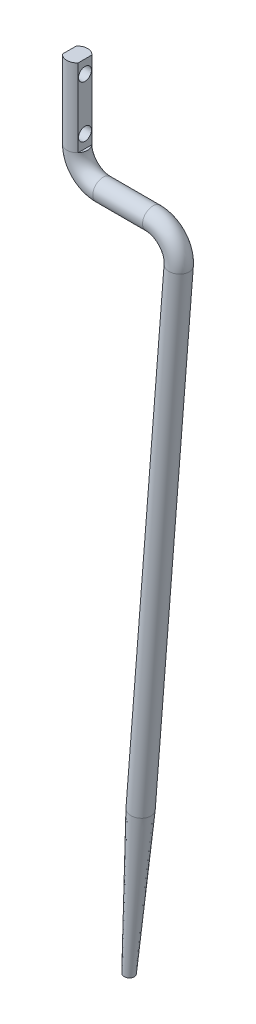
ISO-10303-21;
HEADER;
FILE_DESCRIPTION(('STEP AP214'),'2;1');
FILE_NAME('part.step','',(''),(''),'','','');
FILE_SCHEMA(('AUTOMOTIVE_DESIGN { 1 0 10303 214 1 1 1 1 }'));
ENDSEC;
DATA;
#1=APPLICATION_CONTEXT('core data for automotive mechanical design processes');
#2=APPLICATION_PROTOCOL_DEFINITION('international standard','automotive_design',2000,#1);
#3=PRODUCT_CONTEXT('',#1,'mechanical');
#4=PRODUCT('Part','Part','',(#3));
#5=PRODUCT_RELATED_PRODUCT_CATEGORY('part','',(#4));
#6=PRODUCT_DEFINITION_FORMATION('','',#4);
#7=PRODUCT_DEFINITION_CONTEXT('part definition',#1,'design');
#8=PRODUCT_DEFINITION('design','',#6,#7);
#9=PRODUCT_DEFINITION_SHAPE('','',#8);
#10=(LENGTH_UNIT() NAMED_UNIT(*) SI_UNIT(.MILLI.,.METRE.));
#11=(NAMED_UNIT(*) PLANE_ANGLE_UNIT() SI_UNIT($,.RADIAN.));
#12=(NAMED_UNIT(*) SI_UNIT($,.STERADIAN.) SOLID_ANGLE_UNIT());
#13=UNCERTAINTY_MEASURE_WITH_UNIT(LENGTH_MEASURE(1.E-05),#10,'distance_accuracy_value','');
#14=(GEOMETRIC_REPRESENTATION_CONTEXT(3) GLOBAL_UNCERTAINTY_ASSIGNED_CONTEXT((#13)) GLOBAL_UNIT_ASSIGNED_CONTEXT((#10,
#11,#12)) REPRESENTATION_CONTEXT('',''));
#15=CARTESIAN_POINT('',(0.,0.,0.));
#16=DIRECTION('',(0.,0.,1.));
#17=DIRECTION('',(1.,0.,0.));
#18=AXIS2_PLACEMENT_3D('',#15,#16,#17);
#19=CARTESIAN_POINT('',(0.,40.,0.));
#20=DIRECTION('',(0.,1.,0.));
#21=DIRECTION('',(0.,0.,1.));
#22=AXIS2_PLACEMENT_3D('',#19,#20,#21);
#23=PLANE('',#22);
#24=CARTESIAN_POINT('',(0.,40.,0.));
#25=DIRECTION('',(0.,1.,0.));
#26=DIRECTION('',(0.,0.,1.));
#27=AXIS2_PLACEMENT_3D('',#24,#25,#26);
#28=CIRCLE('',#27,4.);
#29=CARTESIAN_POINT('',(3.,40.,-2.64575131106459));
#30=VERTEX_POINT('',#29);
#31=CARTESIAN_POINT('',(-3.,40.,-2.64575131106459));
#32=VERTEX_POINT('',#31);
#33=EDGE_CURVE('E109',#30,#32,#28,.T.);
#34=ORIENTED_EDGE('',*,*,#33,.T.);
#35=DIRECTION('',(0.,0.,1.));
#36=VECTOR('',#35,1.);
#37=CARTESIAN_POINT('',(-3.,40.,-17.7651075584702));
#38=LINE('',#37,#36);
#39=CARTESIAN_POINT('',(-3.,40.,2.64575131106459));
#40=VERTEX_POINT('',#39);
#41=EDGE_CURVE('E94',#32,#40,#38,.T.);
#42=ORIENTED_EDGE('',*,*,#41,.T.);
#43=CARTESIAN_POINT('',(0.,40.,4.));
#44=VERTEX_POINT('',#43);
#45=EDGE_CURVE('E108',#40,#44,#28,.T.);
#46=ORIENTED_EDGE('',*,*,#45,.T.);
#47=CARTESIAN_POINT('',(3.,40.,2.64575131106458));
#48=VERTEX_POINT('',#47);
#49=EDGE_CURVE('E101',#44,#48,#28,.T.);
#50=ORIENTED_EDGE('',*,*,#49,.T.);
#51=DIRECTION('',(0.,0.,-1.));
#52=VECTOR('',#51,1.);
#53=CARTESIAN_POINT('',(3.,40.,-17.7651075584702));
#54=LINE('',#53,#52);
#55=EDGE_CURVE('E83',#48,#30,#54,.T.);
#56=ORIENTED_EDGE('',*,*,#55,.T.);
#57=EDGE_LOOP('',(#34,#42,#46,#50,#56));
#58=FACE_BOUND('',#57,.T.);
#59=ADVANCED_FACE('F40',(#58),#23,.T.);
#60=CARTESIAN_POINT('',(0.,40.,0.));
#61=DIRECTION('',(0.,-1.,0.));
#62=DIRECTION('',(0.,0.,-1.));
#63=AXIS2_PLACEMENT_3D('',#60,#61,#62);
#64=CYLINDRICAL_SURFACE('',#63,4.);
#65=DIRECTION('',(0.,-1.,0.));
#66=VECTOR('',#65,1.);
#67=CARTESIAN_POINT('',(-3.,40.,-2.64575131106459));
#68=LINE('',#67,#66);
#69=CARTESIAN_POINT('',(-3.,10.0000000000001,-2.64575131106459));
#70=VERTEX_POINT('',#69);
#71=EDGE_CURVE('E115',#32,#70,#68,.T.);
#72=ORIENTED_EDGE('',*,*,#71,.F.);
#73=ORIENTED_EDGE('',*,*,#33,.F.);
#74=DIRECTION('',(0.,-1.,0.));
#75=VECTOR('',#74,1.);
#76=CARTESIAN_POINT('',(3.,40.,-2.64575131106459));
#77=LINE('',#76,#75);
#78=CARTESIAN_POINT('',(3.,10.,-2.64575131106427));
#79=VERTEX_POINT('',#78);
#80=EDGE_CURVE('E89',#79,#30,#77,.F.);
#81=ORIENTED_EDGE('',*,*,#80,.F.);
#82=CARTESIAN_POINT('',(0.,10.0000000000001,0.));
#83=DIRECTION('',(0.,1.,0.));
#84=DIRECTION('',(0.,0.,1.));
#85=AXIS2_PLACEMENT_3D('',#82,#83,#84);
#86=CIRCLE('',#85,4.);
#87=EDGE_CURVE('E202',#79,#70,#86,.T.);
#88=ORIENTED_EDGE('',*,*,#87,.T.);
#89=EDGE_LOOP('',(#72,#73,#81,#88));
#90=FACE_BOUND('',#89,.T.);
#91=ADVANCED_FACE('F156',(#90),#64,.T.);
#92=DIRECTION('',(0.,-1.,0.));
#93=VECTOR('',#92,1.);
#94=CARTESIAN_POINT('',(-3.,40.,2.64575131106459));
#95=LINE('',#94,#93);
#96=CARTESIAN_POINT('',(-3.,10.,2.64575131106491));
#97=VERTEX_POINT('',#96);
#98=EDGE_CURVE('E105',#97,#40,#95,.F.);
#99=ORIENTED_EDGE('',*,*,#98,.F.);
#100=CARTESIAN_POINT('',(3.,10.0000000000001,2.64575131106459));
#101=VERTEX_POINT('',#100);
#102=EDGE_CURVE('E103',#97,#101,#86,.T.);
#103=ORIENTED_EDGE('',*,*,#102,.T.);
#104=DIRECTION('',(0.,-1.,0.));
#105=VECTOR('',#104,1.);
#106=CARTESIAN_POINT('',(3.,40.,2.64575131106459));
#107=LINE('',#106,#105);
#108=EDGE_CURVE('E86',#48,#101,#107,.T.);
#109=ORIENTED_EDGE('',*,*,#108,.F.);
#110=ORIENTED_EDGE('',*,*,#49,.F.);
#111=ORIENTED_EDGE('',*,*,#45,.F.);
#112=EDGE_LOOP('',(#99,#103,#109,#110,#111));
#113=FACE_BOUND('',#112,.T.);
#114=ADVANCED_FACE('F99',(#113),#64,.T.);
#115=CARTESIAN_POINT('',(20.,-257.,0.));
#116=DIRECTION('',(0.0775864303268804,0.996985629700414,0.));
#117=DIRECTION('',(0.,0.,1.));
#118=AXIS2_PLACEMENT_3D('',#115,#116,#117);
#119=PLANE('',#118);
#120=CARTESIAN_POINT('',(20.,-257.,0.));
#121=DIRECTION('',(0.0775864303268804,0.996985629700414,0.));
#122=DIRECTION('',(-0.996985629700415,0.0775864303268804,0.));
#123=AXIS2_PLACEMENT_3D('',#120,#121,#122);
#124=CIRCLE('',#123,1.99999999999688);
#125=CARTESIAN_POINT('',(18.0060287406023,-256.844827139346,0.));
#126=VERTEX_POINT('',#125);
#127=EDGE_CURVE('E12',#126,#126,#124,.F.);
#128=ORIENTED_EDGE('',*,*,#127,.T.);
#129=EDGE_LOOP('',(#128));
#130=FACE_BOUND('',#129,.T.);
#131=ADVANCED_FACE('F163',(#130),#119,.F.);
#132=CARTESIAN_POINT('',(10.,10.,0.));
#133=DIRECTION('',(0.,0.,1.));
#134=DIRECTION('',(1.,0.,0.));
#135=AXIS2_PLACEMENT_3D('',#132,#133,#134);
#136=TOROIDAL_SURFACE('',#135,10.0000000000003,4.);
#137=CARTESIAN_POINT('',(10.0000000000001,0.,0.));
#138=DIRECTION('',(-1.,0.,0.));
#139=DIRECTION('',(0.,0.,1.));
#140=AXIS2_PLACEMENT_3D('',#137,#138,#139);
#141=CIRCLE('',#140,4.);
#142=CARTESIAN_POINT('',(10.0000000000001,0.,4.));
#143=VERTEX_POINT('',#142);
#144=EDGE_CURVE('E203',#143,#143,#141,.T.);
#145=ORIENTED_EDGE('',*,*,#144,.T.);
#146=EDGE_LOOP('',(#145));
#147=FACE_BOUND('',#146,.T.);
#148=EDGE_CURVE('E113',#101,#79,#86,.T.);
#149=ORIENTED_EDGE('',*,*,#148,.F.);
#150=ORIENTED_EDGE('',*,*,#102,.F.);
#151=EDGE_CURVE('E111',#70,#97,#86,.T.);
#152=ORIENTED_EDGE('',*,*,#151,.F.);
#153=ORIENTED_EDGE('',*,*,#87,.F.);
#154=EDGE_LOOP('',(#149,#150,#152,#153));
#155=FACE_BOUND('',#154,.T.);
#156=ADVANCED_FACE('F166',(#147,#155),#136,.T.);
#157=CARTESIAN_POINT('',(10.0000000000001,0.,0.));
#158=DIRECTION('',(1.,0.,0.));
#159=DIRECTION('',(0.,0.,-1.));
#160=AXIS2_PLACEMENT_3D('',#157,#158,#159);
#161=CYLINDRICAL_SURFACE('',#160,4.);
#162=CARTESIAN_POINT('',(29.1915550412629,0.,0.));
#163=DIRECTION('',(-1.,0.,0.));
#164=DIRECTION('',(0.,0.,1.));
#165=AXIS2_PLACEMENT_3D('',#162,#163,#164);
#166=CIRCLE('',#165,4.);
#167=CARTESIAN_POINT('',(29.1915550412629,3.99999999999999,0.));
#168=VERTEX_POINT('',#167);
#169=EDGE_CURVE('E205',#168,#168,#166,.T.);
#170=ORIENTED_EDGE('',*,*,#169,.T.);
#171=EDGE_LOOP('',(#170));
#172=FACE_BOUND('',#171,.T.);
#173=ORIENTED_EDGE('',*,*,#144,.F.);
#174=EDGE_LOOP('',(#173));
#175=FACE_BOUND('',#174,.T.);
#176=ADVANCED_FACE('F175',(#172,#175),#161,.T.);
#177=CARTESIAN_POINT('',(29.1915550412629,-10.,0.));
#178=DIRECTION('',(0.,0.,-1.));
#179=DIRECTION('',(-1.,0.,0.));
#180=AXIS2_PLACEMENT_3D('',#177,#178,#179);
#181=TOROIDAL_SURFACE('',#180,10.,4.);
#182=CARTESIAN_POINT('',(39.161411338267,-10.7758643032688,0.));
#183=DIRECTION('',(0.0775864303268801,0.996985629700415,0.));
#184=DIRECTION('',(0.,0.,1.));
#185=AXIS2_PLACEMENT_3D('',#182,#183,#184);
#186=CIRCLE('',#185,4.);
#187=CARTESIAN_POINT('',(43.1493538570687,-11.0862100245763,0.));
#188=VERTEX_POINT('',#187);
#189=EDGE_CURVE('E210',#188,#188,#186,.T.);
#190=CARTESIAN_POINT('',(29.1915550412629,-10.,0.));
#191=DIRECTION('',(0.,0.,-1.));
#192=DIRECTION('',(-1.,0.,0.));
#193=AXIS2_PLACEMENT_3D('',#190,#191,#192);
#194=CIRCLE('',#193,14.);
#195=EDGE_CURVE('',#168,#188,#194,.T.);
#196=ORIENTED_EDGE('',*,*,#169,.F.);
#197=ORIENTED_EDGE('',*,*,#189,.T.);
#198=ORIENTED_EDGE('',*,*,#195,.T.);
#199=ORIENTED_EDGE('',*,*,#195,.F.);
#200=EDGE_LOOP('',(#196,#198,#197,#199));
#201=FACE_BOUND('',#200,.T.);
#202=ADVANCED_FACE('F171',(#201),#181,.T.);
#203=CARTESIAN_POINT('',(39.161411338267,-10.7758643032688,0.));
#204=DIRECTION('',(-0.0775864303268804,-0.996985629700414,0.));
#205=DIRECTION('',(0.996985629700415,-0.0775864303268804,0.));
#206=AXIS2_PLACEMENT_3D('',#203,#204,#205);
#207=CYLINDRICAL_SURFACE('',#206,4.);
#208=CARTESIAN_POINT('',(24.4435693403235,-199.900133976843,0.));
#209=DIRECTION('',(0.0775864303268804,0.996985629700415,0.));
#210=DIRECTION('',(-0.996985629700415,0.0775864303268804,0.));
#211=AXIS2_PLACEMENT_3D('',#208,#209,#210);
#212=CIRCLE('',#211,4.);
#213=CARTESIAN_POINT('',(20.4556268215219,-199.589788255535,0.));
#214=VERTEX_POINT('',#213);
#215=EDGE_CURVE('E48',#214,#214,#212,.T.);
#216=ORIENTED_EDGE('',*,*,#215,.T.);
#217=EDGE_LOOP('',(#216));
#218=FACE_BOUND('',#217,.T.);
#219=ORIENTED_EDGE('',*,*,#189,.F.);
#220=EDGE_LOOP('',(#219));
#221=FACE_BOUND('',#220,.T.);
#222=ADVANCED_FACE('F168',(#218,#221),#207,.T.);
#223=CARTESIAN_POINT('',(24.4435693403235,-199.900133976843,0.));
#224=DIRECTION('',(0.0775864303268804,0.996985629700415,0.));
#225=DIRECTION('',(-0.996985629700415,0.0775864303268804,0.));
#226=AXIS2_PLACEMENT_3D('',#223,#224,#225);
#227=CONICAL_SURFACE('',#226,4.,0.0349065850398794);
#228=ORIENTED_EDGE('',*,*,#127,.F.);
#229=EDGE_LOOP('',(#228));
#230=FACE_BOUND('',#229,.T.);
#231=ORIENTED_EDGE('',*,*,#215,.F.);
#232=EDGE_LOOP('',(#231));
#233=FACE_BOUND('',#232,.T.);
#234=ADVANCED_FACE('F42',(#230,#233),#227,.T.);
#235=CARTESIAN_POINT('',(19.5957775206314,9.99999999999999,0.));
#236=DIRECTION('',(0.,1.,0.));
#237=DIRECTION('',(0.,0.,1.));
#238=AXIS2_PLACEMENT_3D('',#235,#236,#237);
#239=PLANE('',#238);
#240=ORIENTED_EDGE('',*,*,#151,.T.);
#241=DIRECTION('',(0.,0.,1.));
#242=VECTOR('',#241,1.);
#243=CARTESIAN_POINT('',(-3.,10.,-17.7651075584702));
#244=LINE('',#243,#242);
#245=EDGE_CURVE('E54',#70,#97,#244,.T.);
#246=ORIENTED_EDGE('',*,*,#245,.F.);
#247=EDGE_LOOP('',(#240,#246));
#248=FACE_BOUND('',#247,.T.);
#249=ADVANCED_FACE('F186',(#248),#239,.T.);
#250=CARTESIAN_POINT('',(-3.,10.,-17.7651075584702));
#251=DIRECTION('',(-1.,0.,0.));
#252=DIRECTION('',(0.,0.,1.));
#253=AXIS2_PLACEMENT_3D('',#250,#251,#252);
#254=PLANE('',#253);
#255=CARTESIAN_POINT('',(-3.,35.0000000000001,0.));
#256=DIRECTION('',(-1.,0.,0.));
#257=DIRECTION('',(0.,0.,1.));
#258=AXIS2_PLACEMENT_3D('',#255,#256,#257);
#259=CIRCLE('',#258,2.49999999999999);
#260=CARTESIAN_POINT('',(-3.,35.0000000000001,2.49999999999999));
#261=VERTEX_POINT('',#260);
#262=EDGE_CURVE('E131',#261,#261,#259,.T.);
#263=ORIENTED_EDGE('',*,*,#262,.F.);
#264=EDGE_LOOP('',(#263));
#265=FACE_BOUND('',#264,.T.);
#266=CARTESIAN_POINT('',(-3.,15.0000000000001,0.));
#267=DIRECTION('',(-1.,0.,0.));
#268=DIRECTION('',(0.,0.,1.));
#269=AXIS2_PLACEMENT_3D('',#266,#267,#268);
#270=CIRCLE('',#269,2.49999999999999);
#271=CARTESIAN_POINT('',(-3.,15.0000000000001,2.49999999999999));
#272=VERTEX_POINT('',#271);
#273=EDGE_CURVE('E123',#272,#272,#270,.T.);
#274=ORIENTED_EDGE('',*,*,#273,.F.);
#275=EDGE_LOOP('',(#274));
#276=FACE_BOUND('',#275,.T.);
#277=ORIENTED_EDGE('',*,*,#71,.T.);
#278=ORIENTED_EDGE('',*,*,#245,.T.);
#279=ORIENTED_EDGE('',*,*,#98,.T.);
#280=ORIENTED_EDGE('',*,*,#41,.F.);
#281=EDGE_LOOP('',(#277,#278,#279,#280));
#282=FACE_BOUND('',#281,.T.);
#283=ADVANCED_FACE('F185',(#265,#276,#282),#254,.T.);
#284=ORIENTED_EDGE('',*,*,#148,.T.);
#285=DIRECTION('',(0.,0.,-1.));
#286=VECTOR('',#285,1.);
#287=CARTESIAN_POINT('',(3.,10.,-17.7651075584702));
#288=LINE('',#287,#286);
#289=EDGE_CURVE('E61',#101,#79,#288,.T.);
#290=ORIENTED_EDGE('',*,*,#289,.F.);
#291=EDGE_LOOP('',(#284,#290));
#292=FACE_BOUND('',#291,.T.);
#293=ADVANCED_FACE('F143',(#292),#239,.T.);
#294=CARTESIAN_POINT('',(3.,10.,-17.7651075584702));
#295=DIRECTION('',(1.,0.,0.));
#296=DIRECTION('',(0.,0.,-1.));
#297=AXIS2_PLACEMENT_3D('',#294,#295,#296);
#298=PLANE('',#297);
#299=CARTESIAN_POINT('',(3.,35.0000000000001,0.));
#300=DIRECTION('',(1.,0.,0.));
#301=DIRECTION('',(0.,0.,-1.));
#302=AXIS2_PLACEMENT_3D('',#299,#300,#301);
#303=CIRCLE('',#302,2.49999999999999);
#304=CARTESIAN_POINT('',(3.,35.0000000000001,-2.49999999999999));
#305=VERTEX_POINT('',#304);
#306=EDGE_CURVE('E134',#305,#305,#303,.T.);
#307=ORIENTED_EDGE('',*,*,#306,.F.);
#308=EDGE_LOOP('',(#307));
#309=FACE_BOUND('',#308,.T.);
#310=CARTESIAN_POINT('',(3.,15.0000000000001,0.));
#311=DIRECTION('',(1.,0.,0.));
#312=DIRECTION('',(0.,0.,-1.));
#313=AXIS2_PLACEMENT_3D('',#310,#311,#312);
#314=CIRCLE('',#313,2.49999999999999);
#315=CARTESIAN_POINT('',(3.,15.0000000000001,-2.49999999999999));
#316=VERTEX_POINT('',#315);
#317=EDGE_CURVE('E128',#316,#316,#314,.T.);
#318=ORIENTED_EDGE('',*,*,#317,.F.);
#319=EDGE_LOOP('',(#318));
#320=FACE_BOUND('',#319,.T.);
#321=ORIENTED_EDGE('',*,*,#108,.T.);
#322=ORIENTED_EDGE('',*,*,#289,.T.);
#323=ORIENTED_EDGE('',*,*,#80,.T.);
#324=ORIENTED_EDGE('',*,*,#55,.F.);
#325=EDGE_LOOP('',(#321,#322,#323,#324));
#326=FACE_BOUND('',#325,.T.);
#327=ADVANCED_FACE('F85',(#309,#320,#326),#298,.T.);
#328=CARTESIAN_POINT('',(3.,15.0000000000001,0.));
#329=DIRECTION('',(1.,0.,0.));
#330=DIRECTION('',(0.,0.,-1.));
#331=AXIS2_PLACEMENT_3D('',#328,#329,#330);
#332=CYLINDRICAL_SURFACE('',#331,2.49999999999999);
#333=ORIENTED_EDGE('',*,*,#273,.T.);
#334=EDGE_LOOP('',(#333));
#335=FACE_BOUND('',#334,.T.);
#336=ORIENTED_EDGE('',*,*,#317,.T.);
#337=EDGE_LOOP('',(#336));
#338=FACE_BOUND('',#337,.T.);
#339=ADVANCED_FACE('F142',(#335,#338),#332,.F.);
#340=CARTESIAN_POINT('',(3.,35.0000000000001,0.));
#341=DIRECTION('',(1.,0.,0.));
#342=DIRECTION('',(0.,0.,-1.));
#343=AXIS2_PLACEMENT_3D('',#340,#341,#342);
#344=CYLINDRICAL_SURFACE('',#343,2.49999999999999);
#345=ORIENTED_EDGE('',*,*,#262,.T.);
#346=EDGE_LOOP('',(#345));
#347=FACE_BOUND('',#346,.T.);
#348=ORIENTED_EDGE('',*,*,#306,.T.);
#349=EDGE_LOOP('',(#348));
#350=FACE_BOUND('',#349,.T.);
#351=ADVANCED_FACE('F138',(#347,#350),#344,.F.);
#352=CLOSED_SHELL('',(#59,#91,#114,#131,#156,#176,#202,#222,#234,#249,#283,#293,#327,#339,#351));
#353=MANIFOLD_SOLID_BREP('B2',#352);
#354=ADVANCED_BREP_SHAPE_REPRESENTATION('',(#18,#353),#14);
#355=SHAPE_DEFINITION_REPRESENTATION(#9,#354);
ENDSEC;
END-ISO-10303-21;
